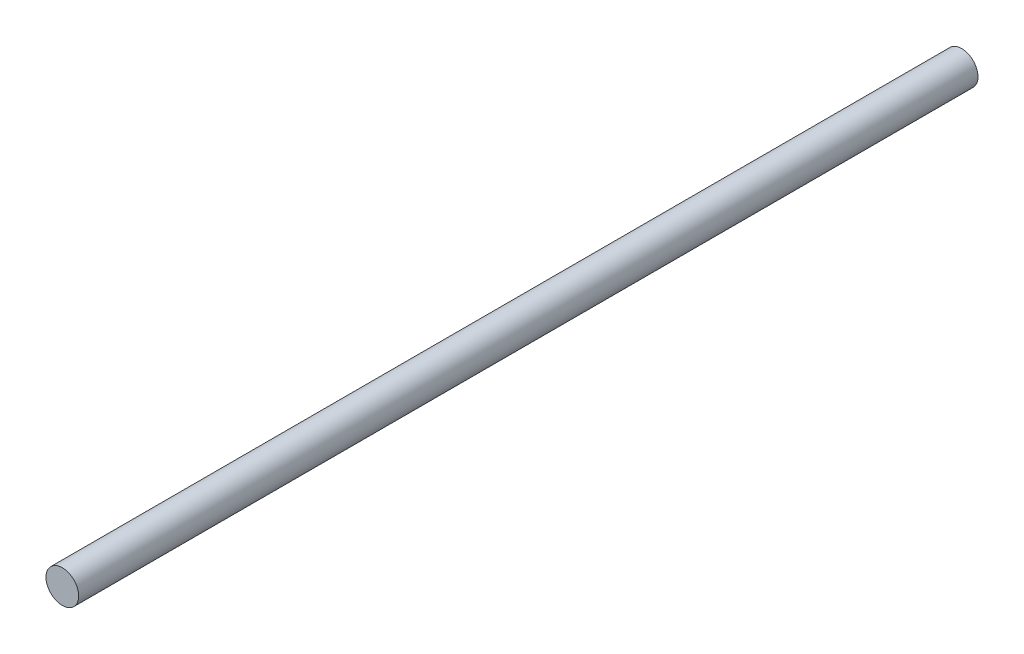
ISO-10303-21;
HEADER;
FILE_DESCRIPTION(('STEP AP214'),'2;1');
FILE_NAME('part.step','',(''),(''),'','','');
FILE_SCHEMA(('AUTOMOTIVE_DESIGN { 1 0 10303 214 1 1 1 1 }'));
ENDSEC;
DATA;
#1=APPLICATION_CONTEXT('core data for automotive mechanical design processes');
#2=APPLICATION_PROTOCOL_DEFINITION('international standard','automotive_design',2000,#1);
#3=PRODUCT_CONTEXT('',#1,'mechanical');
#4=PRODUCT('Part','Part','',(#3));
#5=PRODUCT_RELATED_PRODUCT_CATEGORY('part','',(#4));
#6=PRODUCT_DEFINITION_FORMATION('','',#4);
#7=PRODUCT_DEFINITION_CONTEXT('part definition',#1,'design');
#8=PRODUCT_DEFINITION('design','',#6,#7);
#9=PRODUCT_DEFINITION_SHAPE('','',#8);
#10=(LENGTH_UNIT() NAMED_UNIT(*) SI_UNIT(.MILLI.,.METRE.));
#11=(NAMED_UNIT(*) PLANE_ANGLE_UNIT() SI_UNIT($,.RADIAN.));
#12=(NAMED_UNIT(*) SI_UNIT($,.STERADIAN.) SOLID_ANGLE_UNIT());
#13=UNCERTAINTY_MEASURE_WITH_UNIT(LENGTH_MEASURE(1.E-05),#10,'distance_accuracy_value','');
#14=(GEOMETRIC_REPRESENTATION_CONTEXT(3) GLOBAL_UNCERTAINTY_ASSIGNED_CONTEXT((#13)) GLOBAL_UNIT_ASSIGNED_CONTEXT((#10,
#11,#12)) REPRESENTATION_CONTEXT('',''));
#15=CARTESIAN_POINT('',(0.,0.,0.));
#16=DIRECTION('',(0.,0.,1.));
#17=DIRECTION('',(1.,0.,0.));
#18=AXIS2_PLACEMENT_3D('',#15,#16,#17);
#19=CARTESIAN_POINT('',(0.,0.,55.));
#20=DIRECTION('',(0.,0.,-1.));
#21=DIRECTION('',(-1.,0.,0.));
#22=AXIS2_PLACEMENT_3D('',#19,#20,#21);
#23=CYLINDRICAL_SURFACE('',#22,1.);
#24=CARTESIAN_POINT('',(0.,0.,55.));
#25=DIRECTION('',(0.,0.,1.));
#26=DIRECTION('',(1.,0.,0.));
#27=AXIS2_PLACEMENT_3D('',#24,#25,#26);
#28=CIRCLE('',#27,1.);
#29=CARTESIAN_POINT('',(1.,0.,55.));
#30=VERTEX_POINT('',#29);
#31=EDGE_CURVE('E10',#30,#30,#28,.T.);
#32=ORIENTED_EDGE('',*,*,#31,.F.);
#33=EDGE_LOOP('',(#32));
#34=FACE_BOUND('',#33,.T.);
#35=CARTESIAN_POINT('',(0.,0.,0.));
#36=DIRECTION('',(0.,0.,1.));
#37=DIRECTION('',(1.,0.,0.));
#38=AXIS2_PLACEMENT_3D('',#35,#36,#37);
#39=CIRCLE('',#38,1.);
#40=CARTESIAN_POINT('',(1.,0.,0.));
#41=VERTEX_POINT('',#40);
#42=EDGE_CURVE('E40',#41,#41,#39,.T.);
#43=ORIENTED_EDGE('',*,*,#42,.T.);
#44=EDGE_LOOP('',(#43));
#45=FACE_BOUND('',#44,.T.);
#46=ADVANCED_FACE('F37',(#34,#45),#23,.T.);
#47=CARTESIAN_POINT('',(0.,0.,55.));
#48=DIRECTION('',(0.,0.,1.));
#49=DIRECTION('',(1.,0.,0.));
#50=AXIS2_PLACEMENT_3D('',#47,#48,#49);
#51=PLANE('',#50);
#52=ORIENTED_EDGE('',*,*,#31,.T.);
#53=EDGE_LOOP('',(#52));
#54=FACE_BOUND('',#53,.T.);
#55=ADVANCED_FACE('F54',(#54),#51,.T.);
#56=CARTESIAN_POINT('',(0.,0.,0.));
#57=DIRECTION('',(0.,0.,1.));
#58=DIRECTION('',(1.,0.,0.));
#59=AXIS2_PLACEMENT_3D('',#56,#57,#58);
#60=PLANE('',#59);
#61=ORIENTED_EDGE('',*,*,#42,.F.);
#62=EDGE_LOOP('',(#61));
#63=FACE_BOUND('',#62,.T.);
#64=ADVANCED_FACE('F52',(#63),#60,.F.);
#65=CLOSED_SHELL('',(#46,#55,#64));
#66=MANIFOLD_SOLID_BREP('B2',#65);
#67=ADVANCED_BREP_SHAPE_REPRESENTATION('',(#18,#66),#14);
#68=SHAPE_DEFINITION_REPRESENTATION(#9,#67);
ENDSEC;
END-ISO-10303-21;
